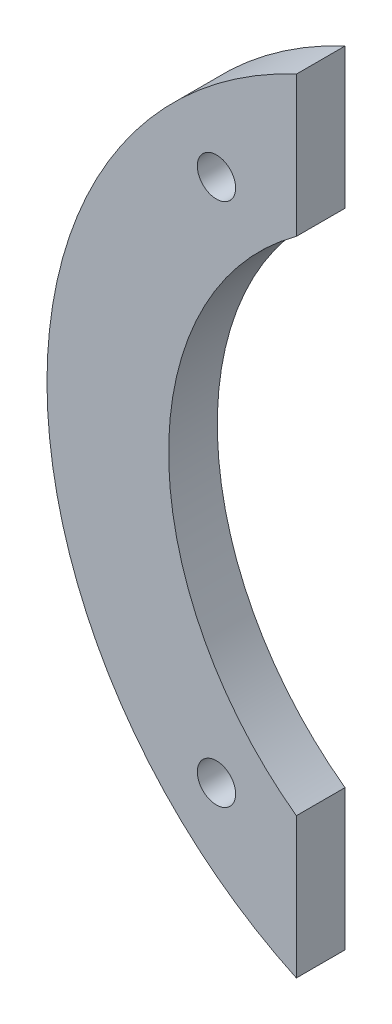
ISO-10303-21;
HEADER;
FILE_DESCRIPTION(('STEP AP214'),'2;1');
FILE_NAME('part.step','',(''),(''),'','','');
FILE_SCHEMA(('AUTOMOTIVE_DESIGN { 1 0 10303 214 1 1 1 1 }'));
ENDSEC;
DATA;
#1=APPLICATION_CONTEXT('core data for automotive mechanical design processes');
#2=APPLICATION_PROTOCOL_DEFINITION('international standard','automotive_design',2000,#1);
#3=PRODUCT_CONTEXT('',#1,'mechanical');
#4=PRODUCT('Part','Part','',(#3));
#5=PRODUCT_RELATED_PRODUCT_CATEGORY('part','',(#4));
#6=PRODUCT_DEFINITION_FORMATION('','',#4);
#7=PRODUCT_DEFINITION_CONTEXT('part definition',#1,'design');
#8=PRODUCT_DEFINITION('design','',#6,#7);
#9=PRODUCT_DEFINITION_SHAPE('','',#8);
#10=(LENGTH_UNIT() NAMED_UNIT(*) SI_UNIT(.MILLI.,.METRE.));
#11=(NAMED_UNIT(*) PLANE_ANGLE_UNIT() SI_UNIT($,.RADIAN.));
#12=(NAMED_UNIT(*) SI_UNIT($,.STERADIAN.) SOLID_ANGLE_UNIT());
#13=UNCERTAINTY_MEASURE_WITH_UNIT(LENGTH_MEASURE(1.E-05),#10,'distance_accuracy_value','');
#14=(GEOMETRIC_REPRESENTATION_CONTEXT(3) GLOBAL_UNCERTAINTY_ASSIGNED_CONTEXT((#13)) GLOBAL_UNIT_ASSIGNED_CONTEXT((#10,
#11,#12)) REPRESENTATION_CONTEXT('',''));
#15=CARTESIAN_POINT('',(0.,0.,0.));
#16=DIRECTION('',(0.,0.,1.));
#17=DIRECTION('',(1.,0.,0.));
#18=AXIS2_PLACEMENT_3D('',#15,#16,#17);
#19=CARTESIAN_POINT('',(0.,0.,4.));
#20=DIRECTION('',(0.,0.,1.));
#21=DIRECTION('',(1.,0.,0.));
#22=AXIS2_PLACEMENT_3D('',#19,#20,#21);
#23=PLANE('',#22);
#24=DIRECTION('',(0.,-1.,0.));
#25=VECTOR('',#24,1.);
#26=CARTESIAN_POINT('',(-15.,40.,4.));
#27=LINE('',#26,#25);
#28=CARTESIAN_POINT('',(-15.,32.1753010863923,4.));
#29=VERTEX_POINT('',#28);
#30=CARTESIAN_POINT('',(-15.,20.6215906273013,4.));
#31=VERTEX_POINT('',#30);
#32=EDGE_CURVE('E65',#29,#31,#27,.T.);
#33=ORIENTED_EDGE('',*,*,#32,.F.);
#34=CARTESIAN_POINT('',(0.,0.,4.));
#35=DIRECTION('',(0.,0.,1.));
#36=DIRECTION('',(1.,0.,0.));
#37=AXIS2_PLACEMENT_3D('',#34,#35,#36);
#38=CIRCLE('',#37,35.5);
#39=CARTESIAN_POINT('',(-15.,-32.1753010863923,4.));
#40=VERTEX_POINT('',#39);
#41=EDGE_CURVE('E98',#29,#40,#38,.T.);
#42=ORIENTED_EDGE('',*,*,#41,.T.);
#43=CARTESIAN_POINT('',(-15.,-20.6215906273013,4.));
#44=VERTEX_POINT('',#43);
#45=EDGE_CURVE('E102',#44,#40,#27,.T.);
#46=ORIENTED_EDGE('',*,*,#45,.F.);
#47=CARTESIAN_POINT('',(0.,0.,4.));
#48=DIRECTION('',(0.,0.,1.));
#49=DIRECTION('',(1.,0.,0.));
#50=AXIS2_PLACEMENT_3D('',#47,#48,#49);
#51=CIRCLE('',#50,25.5);
#52=EDGE_CURVE('E100',#31,#44,#51,.T.);
#53=ORIENTED_EDGE('',*,*,#52,.F.);
#54=EDGE_LOOP('',(#33,#42,#46,#53));
#55=FACE_BOUND('',#54,.T.);
#56=CARTESIAN_POINT('',(-21.56675682619,-21.5667568261894,4.));
#57=DIRECTION('',(0.,0.,1.));
#58=DIRECTION('',(1.,0.,0.));
#59=AXIS2_PLACEMENT_3D('',#56,#57,#58);
#60=CIRCLE('',#59,1.575);
#61=CARTESIAN_POINT('',(-19.99175682619,-21.5667568261894,4.));
#62=VERTEX_POINT('',#61);
#63=EDGE_CURVE('E123',#62,#62,#60,.T.);
#64=ORIENTED_EDGE('',*,*,#63,.F.);
#65=EDGE_LOOP('',(#64));
#66=FACE_BOUND('',#65,.T.);
#67=CARTESIAN_POINT('',(-21.5667568261897,21.5667568261897,4.));
#68=DIRECTION('',(0.,0.,1.));
#69=DIRECTION('',(1.,0.,0.));
#70=AXIS2_PLACEMENT_3D('',#67,#68,#69);
#71=CIRCLE('',#70,1.575);
#72=CARTESIAN_POINT('',(-19.9917568261897,21.5667568261897,4.));
#73=VERTEX_POINT('',#72);
#74=EDGE_CURVE('E119',#73,#73,#71,.T.);
#75=ORIENTED_EDGE('',*,*,#74,.F.);
#76=EDGE_LOOP('',(#75));
#77=FACE_BOUND('',#76,.T.);
#78=ADVANCED_FACE('F42',(#55,#66,#77),#23,.T.);
#79=CARTESIAN_POINT('',(0.,0.,0.));
#80=DIRECTION('',(0.,0.,1.));
#81=DIRECTION('',(1.,0.,0.));
#82=AXIS2_PLACEMENT_3D('',#79,#80,#81);
#83=PLANE('',#82);
#84=CARTESIAN_POINT('',(-21.56675682619,-21.5667568261894,0.));
#85=DIRECTION('',(0.,0.,1.));
#86=DIRECTION('',(1.,0.,0.));
#87=AXIS2_PLACEMENT_3D('',#84,#85,#86);
#88=CIRCLE('',#87,1.575);
#89=CARTESIAN_POINT('',(-19.99175682619,-21.5667568261894,0.));
#90=VERTEX_POINT('',#89);
#91=EDGE_CURVE('E90',#90,#90,#88,.T.);
#92=ORIENTED_EDGE('',*,*,#91,.T.);
#93=EDGE_LOOP('',(#92));
#94=FACE_BOUND('',#93,.T.);
#95=CARTESIAN_POINT('',(-21.5667568261897,21.5667568261897,0.));
#96=DIRECTION('',(0.,0.,1.));
#97=DIRECTION('',(1.,0.,0.));
#98=AXIS2_PLACEMENT_3D('',#95,#96,#97);
#99=CIRCLE('',#98,1.575);
#100=CARTESIAN_POINT('',(-19.9917568261897,21.5667568261897,0.));
#101=VERTEX_POINT('',#100);
#102=EDGE_CURVE('E116',#101,#101,#99,.T.);
#103=ORIENTED_EDGE('',*,*,#102,.T.);
#104=EDGE_LOOP('',(#103));
#105=FACE_BOUND('',#104,.T.);
#106=CARTESIAN_POINT('',(0.,0.,0.));
#107=DIRECTION('',(0.,0.,1.));
#108=DIRECTION('',(1.,0.,0.));
#109=AXIS2_PLACEMENT_3D('',#106,#107,#108);
#110=CIRCLE('',#109,35.5);
#111=CARTESIAN_POINT('',(-15.,32.1753010863923,0.));
#112=VERTEX_POINT('',#111);
#113=CARTESIAN_POINT('',(-15.,-32.1753010863923,0.));
#114=VERTEX_POINT('',#113);
#115=EDGE_CURVE('E106',#112,#114,#110,.T.);
#116=ORIENTED_EDGE('',*,*,#115,.F.);
#117=DIRECTION('',(0.,-1.,0.));
#118=VECTOR('',#117,1.);
#119=CARTESIAN_POINT('',(-15.,40.,0.));
#120=LINE('',#119,#118);
#121=CARTESIAN_POINT('',(-15.,20.6215906273013,0.));
#122=VERTEX_POINT('',#121);
#123=EDGE_CURVE('E84',#112,#122,#120,.T.);
#124=ORIENTED_EDGE('',*,*,#123,.T.);
#125=CARTESIAN_POINT('',(0.,0.,0.));
#126=DIRECTION('',(0.,0.,1.));
#127=DIRECTION('',(1.,0.,0.));
#128=AXIS2_PLACEMENT_3D('',#125,#126,#127);
#129=CIRCLE('',#128,25.5);
#130=CARTESIAN_POINT('',(-15.,-20.6215906273013,0.));
#131=VERTEX_POINT('',#130);
#132=EDGE_CURVE('E112',#122,#131,#129,.T.);
#133=ORIENTED_EDGE('',*,*,#132,.T.);
#134=EDGE_CURVE('E58',#131,#114,#120,.T.);
#135=ORIENTED_EDGE('',*,*,#134,.T.);
#136=EDGE_LOOP('',(#116,#124,#133,#135));
#137=FACE_BOUND('',#136,.T.);
#138=ADVANCED_FACE('F140',(#94,#105,#137),#83,.F.);
#139=CARTESIAN_POINT('',(0.,0.,4.));
#140=DIRECTION('',(0.,0.,-1.));
#141=DIRECTION('',(-1.,0.,0.));
#142=AXIS2_PLACEMENT_3D('',#139,#140,#141);
#143=CYLINDRICAL_SURFACE('',#142,35.5);
#144=ORIENTED_EDGE('',*,*,#41,.F.);
#145=DIRECTION('',(0.,0.,-1.));
#146=VECTOR('',#145,1.);
#147=CARTESIAN_POINT('',(-15.,32.1753010863923,4.));
#148=LINE('',#147,#146);
#149=EDGE_CURVE('E81',#29,#112,#148,.T.);
#150=ORIENTED_EDGE('',*,*,#149,.T.);
#151=ORIENTED_EDGE('',*,*,#115,.T.);
#152=DIRECTION('',(0.,0.,-1.));
#153=VECTOR('',#152,1.);
#154=CARTESIAN_POINT('',(-15.,-32.1753010863923,4.));
#155=LINE('',#154,#153);
#156=EDGE_CURVE('E91',#114,#40,#155,.F.);
#157=ORIENTED_EDGE('',*,*,#156,.T.);
#158=EDGE_LOOP('',(#144,#150,#151,#157));
#159=FACE_BOUND('',#158,.T.);
#160=ADVANCED_FACE('F44',(#159),#143,.T.);
#161=CARTESIAN_POINT('',(0.,0.,4.));
#162=DIRECTION('',(0.,0.,-1.));
#163=DIRECTION('',(-1.,0.,0.));
#164=AXIS2_PLACEMENT_3D('',#161,#162,#163);
#165=CYLINDRICAL_SURFACE('',#164,25.5);
#166=DIRECTION('',(0.,0.,-1.));
#167=VECTOR('',#166,1.);
#168=CARTESIAN_POINT('',(-15.,20.6215906273013,4.));
#169=LINE('',#168,#167);
#170=EDGE_CURVE('E11',#31,#122,#169,.T.);
#171=ORIENTED_EDGE('',*,*,#170,.F.);
#172=ORIENTED_EDGE('',*,*,#52,.T.);
#173=DIRECTION('',(0.,0.,-1.));
#174=VECTOR('',#173,1.);
#175=CARTESIAN_POINT('',(-15.,-20.6215906273013,4.));
#176=LINE('',#175,#174);
#177=EDGE_CURVE('E51',#131,#44,#176,.F.);
#178=ORIENTED_EDGE('',*,*,#177,.F.);
#179=ORIENTED_EDGE('',*,*,#132,.F.);
#180=EDGE_LOOP('',(#171,#172,#178,#179));
#181=FACE_BOUND('',#180,.T.);
#182=ADVANCED_FACE('F142',(#181),#165,.F.);
#183=CARTESIAN_POINT('',(-21.5667568261897,21.5667568261897,0.));
#184=DIRECTION('',(0.,0.,1.));
#185=DIRECTION('',(1.,0.,0.));
#186=AXIS2_PLACEMENT_3D('',#183,#184,#185);
#187=CYLINDRICAL_SURFACE('',#186,1.575);
#188=ORIENTED_EDGE('',*,*,#102,.F.);
#189=EDGE_LOOP('',(#188));
#190=FACE_BOUND('',#189,.T.);
#191=ORIENTED_EDGE('',*,*,#74,.T.);
#192=EDGE_LOOP('',(#191));
#193=FACE_BOUND('',#192,.T.);
#194=ADVANCED_FACE('F151',(#190,#193),#187,.F.);
#195=CARTESIAN_POINT('',(-21.56675682619,-21.5667568261894,0.));
#196=DIRECTION('',(0.,0.,1.));
#197=DIRECTION('',(1.,0.,0.));
#198=AXIS2_PLACEMENT_3D('',#195,#196,#197);
#199=CYLINDRICAL_SURFACE('',#198,1.575);
#200=ORIENTED_EDGE('',*,*,#91,.F.);
#201=EDGE_LOOP('',(#200));
#202=FACE_BOUND('',#201,.T.);
#203=ORIENTED_EDGE('',*,*,#63,.T.);
#204=EDGE_LOOP('',(#203));
#205=FACE_BOUND('',#204,.T.);
#206=ADVANCED_FACE('F145',(#202,#205),#199,.F.);
#207=CARTESIAN_POINT('',(-15.,40.,0.));
#208=DIRECTION('',(-1.,0.,0.));
#209=DIRECTION('',(0.,-1.,0.));
#210=AXIS2_PLACEMENT_3D('',#207,#208,#209);
#211=PLANE('',#210);
#212=ORIENTED_EDGE('',*,*,#134,.F.);
#213=ORIENTED_EDGE('',*,*,#177,.T.);
#214=ORIENTED_EDGE('',*,*,#45,.T.);
#215=ORIENTED_EDGE('',*,*,#156,.F.);
#216=EDGE_LOOP('',(#212,#213,#214,#215));
#217=FACE_BOUND('',#216,.T.);
#218=ADVANCED_FACE('F143',(#217),#211,.F.);
#219=ORIENTED_EDGE('',*,*,#32,.T.);
#220=ORIENTED_EDGE('',*,*,#170,.T.);
#221=ORIENTED_EDGE('',*,*,#123,.F.);
#222=ORIENTED_EDGE('',*,*,#149,.F.);
#223=EDGE_LOOP('',(#219,#220,#221,#222));
#224=FACE_BOUND('',#223,.T.);
#225=ADVANCED_FACE('F82',(#224),#211,.F.);
#226=CLOSED_SHELL('',(#78,#138,#160,#182,#194,#206,#218,#225));
#227=MANIFOLD_SOLID_BREP('B2',#226);
#228=ADVANCED_BREP_SHAPE_REPRESENTATION('',(#18,#227),#14);
#229=SHAPE_DEFINITION_REPRESENTATION(#9,#228);
ENDSEC;
END-ISO-10303-21;
